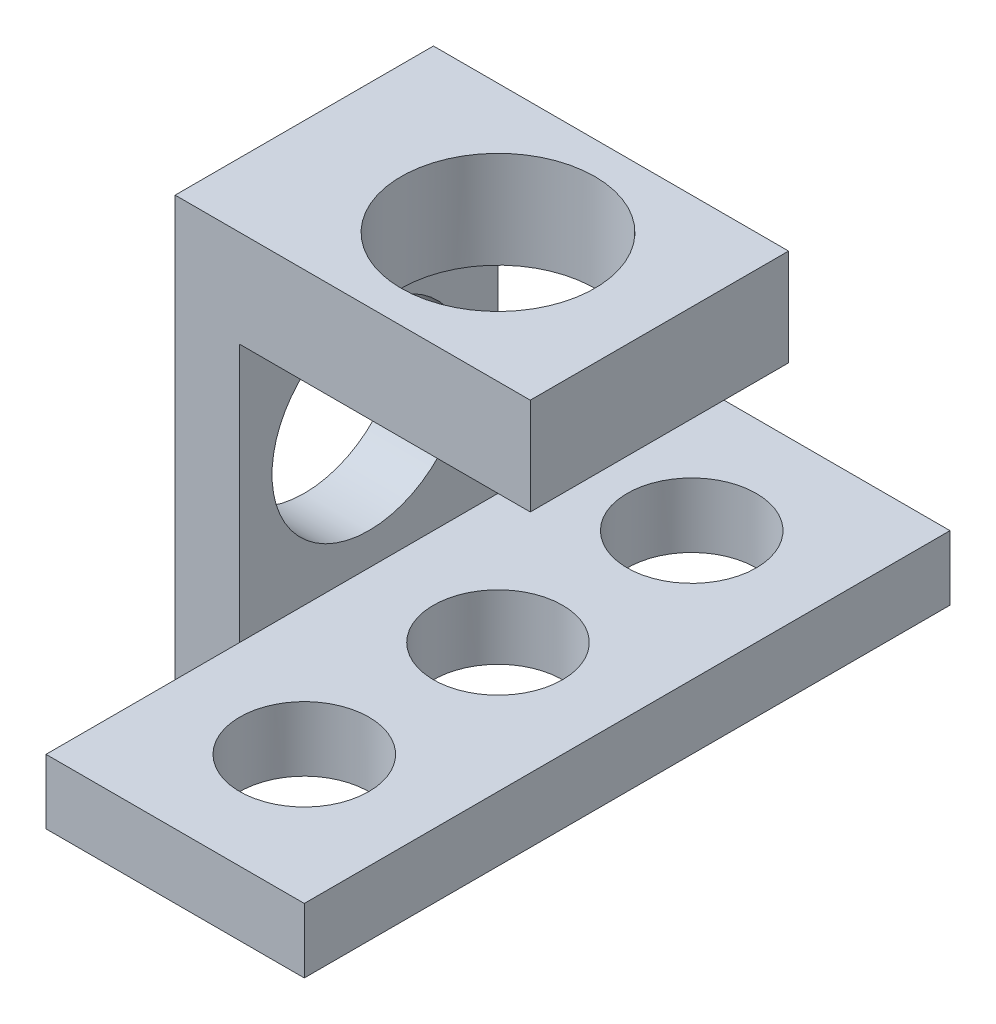
ISO-10303-21;
HEADER;
FILE_DESCRIPTION(('STEP AP214'),'2;1');
FILE_NAME('part.step','',(''),(''),'','','');
FILE_SCHEMA(('AUTOMOTIVE_DESIGN { 1 0 10303 214 1 1 1 1 }'));
ENDSEC;
DATA;
#1=APPLICATION_CONTEXT('core data for automotive mechanical design processes');
#2=APPLICATION_PROTOCOL_DEFINITION('international standard','automotive_design',2000,#1);
#3=PRODUCT_CONTEXT('',#1,'mechanical');
#4=PRODUCT('Part','Part','',(#3));
#5=PRODUCT_RELATED_PRODUCT_CATEGORY('part','',(#4));
#6=PRODUCT_DEFINITION_FORMATION('','',#4);
#7=PRODUCT_DEFINITION_CONTEXT('part definition',#1,'design');
#8=PRODUCT_DEFINITION('design','',#6,#7);
#9=PRODUCT_DEFINITION_SHAPE('','',#8);
#10=(LENGTH_UNIT() NAMED_UNIT(*) SI_UNIT(.MILLI.,.METRE.));
#11=(NAMED_UNIT(*) PLANE_ANGLE_UNIT() SI_UNIT($,.RADIAN.));
#12=(NAMED_UNIT(*) SI_UNIT($,.STERADIAN.) SOLID_ANGLE_UNIT());
#13=UNCERTAINTY_MEASURE_WITH_UNIT(LENGTH_MEASURE(1.E-05),#10,'distance_accuracy_value','');
#14=(GEOMETRIC_REPRESENTATION_CONTEXT(3) GLOBAL_UNCERTAINTY_ASSIGNED_CONTEXT((#13)) GLOBAL_UNIT_ASSIGNED_CONTEXT((#10,
#11,#12)) REPRESENTATION_CONTEXT('',''));
#15=CARTESIAN_POINT('',(0.,0.,0.));
#16=DIRECTION('',(0.,0.,1.));
#17=DIRECTION('',(1.,0.,0.));
#18=AXIS2_PLACEMENT_3D('',#15,#16,#17);
#19=CARTESIAN_POINT('',(-40.,0.,-20.));
#20=DIRECTION('',(-1.,0.,0.));
#21=DIRECTION('',(0.,0.,1.));
#22=AXIS2_PLACEMENT_3D('',#19,#20,#21);
#23=PLANE('',#22);
#24=CARTESIAN_POINT('',(-40.,30.,0.));
#25=DIRECTION('',(-1.,0.,0.));
#26=DIRECTION('',(0.,0.,1.));
#27=AXIS2_PLACEMENT_3D('',#24,#25,#26);
#28=CIRCLE('',#27,15.);
#29=CARTESIAN_POINT('',(-40.,15.,0.));
#30=VERTEX_POINT('',#29);
#31=EDGE_CURVE('E145',#30,#30,#28,.F.);
#32=ORIENTED_EDGE('',*,*,#31,.F.);
#33=EDGE_LOOP('',(#32));
#34=FACE_BOUND('',#33,.T.);
#35=DIRECTION('',(0.,0.,1.));
#36=VECTOR('',#35,1.);
#37=CARTESIAN_POINT('',(-40.,10.,-50.));
#38=LINE('',#37,#36);
#39=CARTESIAN_POINT('',(-40.,10.,-20.));
#40=VERTEX_POINT('',#39);
#41=CARTESIAN_POINT('',(-40.,10.,20.));
#42=VERTEX_POINT('',#41);
#43=EDGE_CURVE('E51',#40,#42,#38,.T.);
#44=ORIENTED_EDGE('',*,*,#43,.F.);
#45=DIRECTION('',(0.,-1.,0.));
#46=VECTOR('',#45,1.);
#47=CARTESIAN_POINT('',(-40.,0.,-20.));
#48=LINE('',#47,#46);
#49=CARTESIAN_POINT('',(-40.,50.,-20.));
#50=VERTEX_POINT('',#49);
#51=EDGE_CURVE('E189',#50,#40,#48,.T.);
#52=ORIENTED_EDGE('',*,*,#51,.F.);
#53=DIRECTION('',(0.,0.,1.));
#54=VECTOR('',#53,1.);
#55=CARTESIAN_POINT('',(-40.,50.,-20.));
#56=LINE('',#55,#54);
#57=CARTESIAN_POINT('',(-40.,50.,20.));
#58=VERTEX_POINT('',#57);
#59=EDGE_CURVE('E38',#50,#58,#56,.T.);
#60=ORIENTED_EDGE('',*,*,#59,.T.);
#61=DIRECTION('',(0.,-1.,0.));
#62=VECTOR('',#61,1.);
#63=CARTESIAN_POINT('',(-40.,0.,20.));
#64=LINE('',#63,#62);
#65=EDGE_CURVE('E172',#58,#42,#64,.T.);
#66=ORIENTED_EDGE('',*,*,#65,.T.);
#67=EDGE_LOOP('',(#44,#52,#60,#66));
#68=FACE_BOUND('',#67,.T.);
#69=ADVANCED_FACE('F35',(#34,#68),#23,.F.);
#70=CARTESIAN_POINT('',(0.,0.,-20.));
#71=DIRECTION('',(0.,1.,0.));
#72=DIRECTION('',(-1.,0.,0.));
#73=AXIS2_PLACEMENT_3D('',#70,#71,#72);
#74=PLANE('',#73);
#75=CARTESIAN_POINT('',(-20.,0.,30.));
#76=DIRECTION('',(0.,-1.,0.));
#77=DIRECTION('',(1.,0.,0.));
#78=AXIS2_PLACEMENT_3D('',#75,#76,#77);
#79=CIRCLE('',#78,10.);
#80=CARTESIAN_POINT('',(-10.,0.,30.));
#81=VERTEX_POINT('',#80);
#82=EDGE_CURVE('E417',#81,#81,#79,.T.);
#83=ORIENTED_EDGE('',*,*,#82,.F.);
#84=EDGE_LOOP('',(#83));
#85=FACE_BOUND('',#84,.T.);
#86=CARTESIAN_POINT('',(-20.,0.,0.));
#87=DIRECTION('',(0.,-1.,0.));
#88=DIRECTION('',(1.,0.,0.));
#89=AXIS2_PLACEMENT_3D('',#86,#87,#88);
#90=CIRCLE('',#89,10.);
#91=CARTESIAN_POINT('',(-10.,0.,0.));
#92=VERTEX_POINT('',#91);
#93=EDGE_CURVE('E424',#92,#92,#90,.T.);
#94=ORIENTED_EDGE('',*,*,#93,.F.);
#95=EDGE_LOOP('',(#94));
#96=FACE_BOUND('',#95,.T.);
#97=CARTESIAN_POINT('',(-20.,0.,-30.));
#98=DIRECTION('',(0.,-1.,0.));
#99=DIRECTION('',(1.,0.,0.));
#100=AXIS2_PLACEMENT_3D('',#97,#98,#99);
#101=CIRCLE('',#100,10.);
#102=CARTESIAN_POINT('',(-10.,0.,-30.));
#103=VERTEX_POINT('',#102);
#104=EDGE_CURVE('E430',#103,#103,#101,.T.);
#105=ORIENTED_EDGE('',*,*,#104,.F.);
#106=EDGE_LOOP('',(#105));
#107=FACE_BOUND('',#106,.T.);
#108=DIRECTION('',(-1.,0.,0.));
#109=VECTOR('',#108,1.);
#110=CARTESIAN_POINT('',(0.,0.,-20.));
#111=LINE('',#110,#109);
#112=CARTESIAN_POINT('',(-40.,0.,-20.));
#113=VERTEX_POINT('',#112);
#114=CARTESIAN_POINT('',(-50.,0.,-20.));
#115=VERTEX_POINT('',#114);
#116=EDGE_CURVE('E199',#113,#115,#111,.T.);
#117=ORIENTED_EDGE('',*,*,#116,.F.);
#118=DIRECTION('',(0.,0.,1.));
#119=VECTOR('',#118,1.);
#120=CARTESIAN_POINT('',(-40.,0.,-50.));
#121=LINE('',#120,#119);
#122=CARTESIAN_POINT('',(-40.,0.,-50.));
#123=VERTEX_POINT('',#122);
#124=EDGE_CURVE('E168',#123,#113,#121,.T.);
#125=ORIENTED_EDGE('',*,*,#124,.F.);
#126=DIRECTION('',(-1.,0.,0.));
#127=VECTOR('',#126,1.);
#128=CARTESIAN_POINT('',(0.,0.,-50.));
#129=LINE('',#128,#127);
#130=CARTESIAN_POINT('',(0.,0.,-50.));
#131=VERTEX_POINT('',#130);
#132=EDGE_CURVE('E160',#131,#123,#129,.T.);
#133=ORIENTED_EDGE('',*,*,#132,.F.);
#134=DIRECTION('',(0.,0.,1.));
#135=VECTOR('',#134,1.);
#136=CARTESIAN_POINT('',(0.,0.,-50.));
#137=LINE('',#136,#135);
#138=CARTESIAN_POINT('',(0.,0.,50.));
#139=VERTEX_POINT('',#138);
#140=EDGE_CURVE('E166',#131,#139,#137,.T.);
#141=ORIENTED_EDGE('',*,*,#140,.T.);
#142=DIRECTION('',(-1.,0.,0.));
#143=VECTOR('',#142,1.);
#144=CARTESIAN_POINT('',(0.,0.,50.));
#145=LINE('',#144,#143);
#146=CARTESIAN_POINT('',(-40.,0.,50.));
#147=VERTEX_POINT('',#146);
#148=EDGE_CURVE('E140',#139,#147,#145,.T.);
#149=ORIENTED_EDGE('',*,*,#148,.T.);
#150=CARTESIAN_POINT('',(-40.,0.,20.));
#151=VERTEX_POINT('',#150);
#152=EDGE_CURVE('E136',#151,#147,#121,.T.);
#153=ORIENTED_EDGE('',*,*,#152,.F.);
#154=DIRECTION('',(-1.,0.,0.));
#155=VECTOR('',#154,1.);
#156=CARTESIAN_POINT('',(0.,0.,20.));
#157=LINE('',#156,#155);
#158=CARTESIAN_POINT('',(-50.,0.,20.));
#159=VERTEX_POINT('',#158);
#160=EDGE_CURVE('E186',#151,#159,#157,.T.);
#161=ORIENTED_EDGE('',*,*,#160,.T.);
#162=DIRECTION('',(0.,0.,1.));
#163=VECTOR('',#162,1.);
#164=CARTESIAN_POINT('',(-50.,0.,-20.));
#165=LINE('',#164,#163);
#166=EDGE_CURVE('E11',#115,#159,#165,.T.);
#167=ORIENTED_EDGE('',*,*,#166,.F.);
#168=EDGE_LOOP('',(#117,#125,#133,#141,#149,#153,#161,#167));
#169=FACE_BOUND('',#168,.T.);
#170=ADVANCED_FACE('F227',(#85,#96,#107,#169),#74,.F.);
#171=CARTESIAN_POINT('',(-50.,0.,-20.));
#172=DIRECTION('',(1.,0.,0.));
#173=DIRECTION('',(0.,1.,0.));
#174=AXIS2_PLACEMENT_3D('',#171,#172,#173);
#175=PLANE('',#174);
#176=CARTESIAN_POINT('',(-50.,30.,0.));
#177=DIRECTION('',(-1.,0.,0.));
#178=DIRECTION('',(0.,-1.,0.));
#179=AXIS2_PLACEMENT_3D('',#176,#177,#178);
#180=CIRCLE('',#179,15.);
#181=CARTESIAN_POINT('',(-50.,15.,0.));
#182=VERTEX_POINT('',#181);
#183=EDGE_CURVE('E148',#182,#182,#180,.T.);
#184=ORIENTED_EDGE('',*,*,#183,.F.);
#185=EDGE_LOOP('',(#184));
#186=FACE_BOUND('',#185,.T.);
#187=ORIENTED_EDGE('',*,*,#166,.T.);
#188=DIRECTION('',(0.,1.,0.));
#189=VECTOR('',#188,1.);
#190=CARTESIAN_POINT('',(-50.,0.,20.));
#191=LINE('',#190,#189);
#192=CARTESIAN_POINT('',(-50.,65.,20.));
#193=VERTEX_POINT('',#192);
#194=EDGE_CURVE('E183',#159,#193,#191,.T.);
#195=ORIENTED_EDGE('',*,*,#194,.T.);
#196=DIRECTION('',(0.,0.,1.));
#197=VECTOR('',#196,1.);
#198=CARTESIAN_POINT('',(-50.,65.,-20.));
#199=LINE('',#198,#197);
#200=CARTESIAN_POINT('',(-50.,65.,-20.));
#201=VERTEX_POINT('',#200);
#202=EDGE_CURVE('E43',#201,#193,#199,.T.);
#203=ORIENTED_EDGE('',*,*,#202,.F.);
#204=DIRECTION('',(0.,1.,0.));
#205=VECTOR('',#204,1.);
#206=CARTESIAN_POINT('',(-50.,0.,-20.));
#207=LINE('',#206,#205);
#208=EDGE_CURVE('E197',#115,#201,#207,.T.);
#209=ORIENTED_EDGE('',*,*,#208,.F.);
#210=EDGE_LOOP('',(#187,#195,#203,#209));
#211=FACE_BOUND('',#210,.T.);
#212=ADVANCED_FACE('F232',(#186,#211),#175,.F.);
#213=CARTESIAN_POINT('',(0.,65.,-20.));
#214=DIRECTION('',(0.,-1.,0.));
#215=DIRECTION('',(0.,0.,-1.));
#216=AXIS2_PLACEMENT_3D('',#213,#214,#215);
#217=PLANE('',#216);
#218=CARTESIAN_POINT('',(-20.,65.,0.));
#219=DIRECTION('',(0.,1.,0.));
#220=DIRECTION('',(0.,0.,1.));
#221=AXIS2_PLACEMENT_3D('',#218,#219,#220);
#222=CIRCLE('',#221,15.);
#223=CARTESIAN_POINT('',(-20.,65.,15.));
#224=VERTEX_POINT('',#223);
#225=EDGE_CURVE('E279',#224,#224,#222,.T.);
#226=ORIENTED_EDGE('',*,*,#225,.F.);
#227=EDGE_LOOP('',(#226));
#228=FACE_BOUND('',#227,.T.);
#229=ORIENTED_EDGE('',*,*,#202,.T.);
#230=DIRECTION('',(1.,0.,0.));
#231=VECTOR('',#230,1.);
#232=CARTESIAN_POINT('',(0.,65.,20.));
#233=LINE('',#232,#231);
#234=CARTESIAN_POINT('',(5.,65.,20.));
#235=VERTEX_POINT('',#234);
#236=EDGE_CURVE('E180',#193,#235,#233,.T.);
#237=ORIENTED_EDGE('',*,*,#236,.T.);
#238=DIRECTION('',(0.,0.,1.));
#239=VECTOR('',#238,1.);
#240=CARTESIAN_POINT('',(5.,65.,-20.));
#241=LINE('',#240,#239);
#242=CARTESIAN_POINT('',(5.,65.,-20.));
#243=VERTEX_POINT('',#242);
#244=EDGE_CURVE('E202',#243,#235,#241,.T.);
#245=ORIENTED_EDGE('',*,*,#244,.F.);
#246=DIRECTION('',(1.,0.,0.));
#247=VECTOR('',#246,1.);
#248=CARTESIAN_POINT('',(0.,65.,-20.));
#249=LINE('',#248,#247);
#250=EDGE_CURVE('E195',#201,#243,#249,.T.);
#251=ORIENTED_EDGE('',*,*,#250,.F.);
#252=EDGE_LOOP('',(#229,#237,#245,#251));
#253=FACE_BOUND('',#252,.T.);
#254=ADVANCED_FACE('F222',(#228,#253),#217,.F.);
#255=CARTESIAN_POINT('',(5.00000000000001,0.,-20.));
#256=DIRECTION('',(-1.,0.,0.));
#257=DIRECTION('',(0.,-1.,0.));
#258=AXIS2_PLACEMENT_3D('',#255,#256,#257);
#259=PLANE('',#258);
#260=ORIENTED_EDGE('',*,*,#244,.T.);
#261=DIRECTION('',(0.,-1.,0.));
#262=VECTOR('',#261,1.);
#263=CARTESIAN_POINT('',(5.00000000000001,0.,20.));
#264=LINE('',#263,#262);
#265=CARTESIAN_POINT('',(5.,50.,20.));
#266=VERTEX_POINT('',#265);
#267=EDGE_CURVE('E177',#235,#266,#264,.T.);
#268=ORIENTED_EDGE('',*,*,#267,.T.);
#269=DIRECTION('',(0.,0.,1.));
#270=VECTOR('',#269,1.);
#271=CARTESIAN_POINT('',(5.,50.,-20.));
#272=LINE('',#271,#270);
#273=CARTESIAN_POINT('',(5.,50.,-20.));
#274=VERTEX_POINT('',#273);
#275=EDGE_CURVE('E203',#274,#266,#272,.T.);
#276=ORIENTED_EDGE('',*,*,#275,.F.);
#277=DIRECTION('',(0.,-1.,0.));
#278=VECTOR('',#277,1.);
#279=CARTESIAN_POINT('',(5.00000000000001,0.,-20.));
#280=LINE('',#279,#278);
#281=EDGE_CURVE('E193',#243,#274,#280,.T.);
#282=ORIENTED_EDGE('',*,*,#281,.F.);
#283=EDGE_LOOP('',(#260,#268,#276,#282));
#284=FACE_BOUND('',#283,.T.);
#285=ADVANCED_FACE('F214',(#284),#259,.F.);
#286=CARTESIAN_POINT('',(0.,50.,-20.));
#287=DIRECTION('',(0.,1.,0.));
#288=DIRECTION('',(-1.,0.,0.));
#289=AXIS2_PLACEMENT_3D('',#286,#287,#288);
#290=PLANE('',#289);
#291=CARTESIAN_POINT('',(-20.,50.,0.));
#292=DIRECTION('',(0.,1.,0.));
#293=DIRECTION('',(-1.,0.,0.));
#294=AXIS2_PLACEMENT_3D('',#291,#292,#293);
#295=CIRCLE('',#294,15.);
#296=CARTESIAN_POINT('',(-35.,50.,0.));
#297=VERTEX_POINT('',#296);
#298=EDGE_CURVE('E422',#297,#297,#295,.F.);
#299=ORIENTED_EDGE('',*,*,#298,.F.);
#300=EDGE_LOOP('',(#299));
#301=FACE_BOUND('',#300,.T.);
#302=ORIENTED_EDGE('',*,*,#275,.T.);
#303=DIRECTION('',(-1.,0.,0.));
#304=VECTOR('',#303,1.);
#305=CARTESIAN_POINT('',(0.,50.,20.));
#306=LINE('',#305,#304);
#307=EDGE_CURVE('E174',#266,#58,#306,.T.);
#308=ORIENTED_EDGE('',*,*,#307,.T.);
#309=ORIENTED_EDGE('',*,*,#59,.F.);
#310=DIRECTION('',(-1.,0.,0.));
#311=VECTOR('',#310,1.);
#312=CARTESIAN_POINT('',(0.,50.,-20.));
#313=LINE('',#312,#311);
#314=EDGE_CURVE('E191',#274,#50,#313,.T.);
#315=ORIENTED_EDGE('',*,*,#314,.F.);
#316=EDGE_LOOP('',(#302,#308,#309,#315));
#317=FACE_BOUND('',#316,.T.);
#318=ADVANCED_FACE('F211',(#301,#317),#290,.F.);
#319=CARTESIAN_POINT('',(0.,0.,-20.));
#320=DIRECTION('',(0.,0.,1.));
#321=DIRECTION('',(1.,0.,0.));
#322=AXIS2_PLACEMENT_3D('',#319,#320,#321);
#323=PLANE('',#322);
#324=ORIENTED_EDGE('',*,*,#51,.T.);
#325=DIRECTION('',(0.,-1.,0.));
#326=VECTOR('',#325,1.);
#327=CARTESIAN_POINT('',(-40.,0.,-20.));
#328=LINE('',#327,#326);
#329=EDGE_CURVE('E165',#40,#113,#328,.T.);
#330=ORIENTED_EDGE('',*,*,#329,.T.);
#331=ORIENTED_EDGE('',*,*,#116,.T.);
#332=ORIENTED_EDGE('',*,*,#208,.T.);
#333=ORIENTED_EDGE('',*,*,#250,.T.);
#334=ORIENTED_EDGE('',*,*,#281,.T.);
#335=ORIENTED_EDGE('',*,*,#314,.T.);
#336=EDGE_LOOP('',(#324,#330,#331,#332,#333,#334,#335));
#337=FACE_BOUND('',#336,.T.);
#338=ADVANCED_FACE('F213',(#337),#323,.F.);
#339=CARTESIAN_POINT('',(0.,0.,20.));
#340=DIRECTION('',(0.,0.,1.));
#341=DIRECTION('',(1.,0.,0.));
#342=AXIS2_PLACEMENT_3D('',#339,#340,#341);
#343=PLANE('',#342);
#344=ORIENTED_EDGE('',*,*,#65,.F.);
#345=ORIENTED_EDGE('',*,*,#307,.F.);
#346=ORIENTED_EDGE('',*,*,#267,.F.);
#347=ORIENTED_EDGE('',*,*,#236,.F.);
#348=ORIENTED_EDGE('',*,*,#194,.F.);
#349=ORIENTED_EDGE('',*,*,#160,.F.);
#350=EDGE_CURVE('E59',#42,#151,#64,.T.);
#351=ORIENTED_EDGE('',*,*,#350,.F.);
#352=EDGE_LOOP('',(#344,#345,#346,#347,#348,#349,#351));
#353=FACE_BOUND('',#352,.T.);
#354=ADVANCED_FACE('F209',(#353),#343,.T.);
#355=CARTESIAN_POINT('',(-40.,0.,-50.));
#356=DIRECTION('',(-1.,0.,0.));
#357=DIRECTION('',(0.,0.,1.));
#358=AXIS2_PLACEMENT_3D('',#355,#356,#357);
#359=PLANE('',#358);
#360=ORIENTED_EDGE('',*,*,#329,.F.);
#361=CARTESIAN_POINT('',(-40.,10.,-50.));
#362=VERTEX_POINT('',#361);
#363=EDGE_CURVE('E131',#362,#40,#38,.T.);
#364=ORIENTED_EDGE('',*,*,#363,.F.);
#365=DIRECTION('',(0.,-1.,0.));
#366=VECTOR('',#365,1.);
#367=CARTESIAN_POINT('',(-40.,0.,-50.));
#368=LINE('',#367,#366);
#369=EDGE_CURVE('E157',#362,#123,#368,.T.);
#370=ORIENTED_EDGE('',*,*,#369,.T.);
#371=ORIENTED_EDGE('',*,*,#124,.T.);
#372=EDGE_LOOP('',(#360,#364,#370,#371));
#373=FACE_BOUND('',#372,.T.);
#374=ADVANCED_FACE('F263',(#373),#359,.T.);
#375=CARTESIAN_POINT('',(0.,10.,-50.));
#376=DIRECTION('',(0.,-1.,0.));
#377=DIRECTION('',(0.,0.,-1.));
#378=AXIS2_PLACEMENT_3D('',#375,#376,#377);
#379=PLANE('',#378);
#380=CARTESIAN_POINT('',(-20.,10.,30.));
#381=DIRECTION('',(0.,-1.,0.));
#382=DIRECTION('',(0.,0.,-1.));
#383=AXIS2_PLACEMENT_3D('',#380,#381,#382);
#384=CIRCLE('',#383,10.);
#385=CARTESIAN_POINT('',(-20.,10.,20.));
#386=VERTEX_POINT('',#385);
#387=EDGE_CURVE('E420',#386,#386,#384,.F.);
#388=ORIENTED_EDGE('',*,*,#387,.F.);
#389=EDGE_LOOP('',(#388));
#390=FACE_BOUND('',#389,.T.);
#391=CARTESIAN_POINT('',(-20.,10.,0.));
#392=DIRECTION('',(0.,-1.,0.));
#393=DIRECTION('',(0.,0.,-1.));
#394=AXIS2_PLACEMENT_3D('',#391,#392,#393);
#395=CIRCLE('',#394,10.);
#396=CARTESIAN_POINT('',(-20.,10.,-10.));
#397=VERTEX_POINT('',#396);
#398=EDGE_CURVE('E427',#397,#397,#395,.F.);
#399=ORIENTED_EDGE('',*,*,#398,.F.);
#400=EDGE_LOOP('',(#399));
#401=FACE_BOUND('',#400,.T.);
#402=CARTESIAN_POINT('',(-20.,10.,-30.));
#403=DIRECTION('',(0.,-1.,0.));
#404=DIRECTION('',(0.,0.,-1.));
#405=AXIS2_PLACEMENT_3D('',#402,#403,#404);
#406=CIRCLE('',#405,10.);
#407=CARTESIAN_POINT('',(-20.,10.,-40.));
#408=VERTEX_POINT('',#407);
#409=EDGE_CURVE('E433',#408,#408,#406,.F.);
#410=ORIENTED_EDGE('',*,*,#409,.F.);
#411=EDGE_LOOP('',(#410));
#412=FACE_BOUND('',#411,.T.);
#413=ORIENTED_EDGE('',*,*,#363,.T.);
#414=ORIENTED_EDGE('',*,*,#43,.T.);
#415=CARTESIAN_POINT('',(-40.,10.,50.));
#416=VERTEX_POINT('',#415);
#417=EDGE_CURVE('E120',#42,#416,#38,.T.);
#418=ORIENTED_EDGE('',*,*,#417,.T.);
#419=DIRECTION('',(1.,0.,0.));
#420=VECTOR('',#419,1.);
#421=CARTESIAN_POINT('',(0.,10.,50.));
#422=LINE('',#421,#420);
#423=CARTESIAN_POINT('',(0.,10.,50.));
#424=VERTEX_POINT('',#423);
#425=EDGE_CURVE('E126',#416,#424,#422,.T.);
#426=ORIENTED_EDGE('',*,*,#425,.T.);
#427=DIRECTION('',(0.,0.,1.));
#428=VECTOR('',#427,1.);
#429=CARTESIAN_POINT('',(0.,10.,-50.));
#430=LINE('',#429,#428);
#431=CARTESIAN_POINT('',(0.,10.,-50.));
#432=VERTEX_POINT('',#431);
#433=EDGE_CURVE('E163',#432,#424,#430,.T.);
#434=ORIENTED_EDGE('',*,*,#433,.F.);
#435=DIRECTION('',(1.,0.,0.));
#436=VECTOR('',#435,1.);
#437=CARTESIAN_POINT('',(0.,10.,-50.));
#438=LINE('',#437,#436);
#439=EDGE_CURVE('E154',#362,#432,#438,.T.);
#440=ORIENTED_EDGE('',*,*,#439,.F.);
#441=EDGE_LOOP('',(#413,#414,#418,#426,#434,#440));
#442=FACE_BOUND('',#441,.T.);
#443=ADVANCED_FACE('F123',(#390,#401,#412,#442),#379,.F.);
#444=CARTESIAN_POINT('',(0.,0.,-50.));
#445=DIRECTION('',(-1.,0.,0.));
#446=DIRECTION('',(0.,-1.,0.));
#447=AXIS2_PLACEMENT_3D('',#444,#445,#446);
#448=PLANE('',#447);
#449=ORIENTED_EDGE('',*,*,#433,.T.);
#450=DIRECTION('',(0.,-1.,0.));
#451=VECTOR('',#450,1.);
#452=CARTESIAN_POINT('',(0.,0.,50.));
#453=LINE('',#452,#451);
#454=EDGE_CURVE('E144',#424,#139,#453,.T.);
#455=ORIENTED_EDGE('',*,*,#454,.T.);
#456=ORIENTED_EDGE('',*,*,#140,.F.);
#457=DIRECTION('',(0.,-1.,0.));
#458=VECTOR('',#457,1.);
#459=CARTESIAN_POINT('',(0.,0.,-50.));
#460=LINE('',#459,#458);
#461=EDGE_CURVE('E129',#432,#131,#460,.T.);
#462=ORIENTED_EDGE('',*,*,#461,.F.);
#463=EDGE_LOOP('',(#449,#455,#456,#462));
#464=FACE_BOUND('',#463,.T.);
#465=ADVANCED_FACE('F257',(#464),#448,.F.);
#466=ORIENTED_EDGE('',*,*,#417,.F.);
#467=ORIENTED_EDGE('',*,*,#350,.T.);
#468=ORIENTED_EDGE('',*,*,#152,.T.);
#469=DIRECTION('',(0.,-1.,0.));
#470=VECTOR('',#469,1.);
#471=CARTESIAN_POINT('',(-40.,0.,50.));
#472=LINE('',#471,#470);
#473=EDGE_CURVE('E133',#416,#147,#472,.T.);
#474=ORIENTED_EDGE('',*,*,#473,.F.);
#475=EDGE_LOOP('',(#466,#467,#468,#474));
#476=FACE_BOUND('',#475,.T.);
#477=ADVANCED_FACE('F134',(#476),#359,.T.);
#478=CARTESIAN_POINT('',(0.,0.,-50.));
#479=DIRECTION('',(0.,0.,1.));
#480=DIRECTION('',(1.,0.,0.));
#481=AXIS2_PLACEMENT_3D('',#478,#479,#480);
#482=PLANE('',#481);
#483=ORIENTED_EDGE('',*,*,#439,.T.);
#484=ORIENTED_EDGE('',*,*,#461,.T.);
#485=ORIENTED_EDGE('',*,*,#132,.T.);
#486=ORIENTED_EDGE('',*,*,#369,.F.);
#487=EDGE_LOOP('',(#483,#484,#485,#486));
#488=FACE_BOUND('',#487,.T.);
#489=ADVANCED_FACE('F249',(#488),#482,.F.);
#490=CARTESIAN_POINT('',(0.,0.,50.));
#491=DIRECTION('',(0.,0.,1.));
#492=DIRECTION('',(1.,0.,0.));
#493=AXIS2_PLACEMENT_3D('',#490,#491,#492);
#494=PLANE('',#493);
#495=ORIENTED_EDGE('',*,*,#425,.F.);
#496=ORIENTED_EDGE('',*,*,#473,.T.);
#497=ORIENTED_EDGE('',*,*,#148,.F.);
#498=ORIENTED_EDGE('',*,*,#454,.F.);
#499=EDGE_LOOP('',(#495,#496,#497,#498));
#500=FACE_BOUND('',#499,.T.);
#501=ADVANCED_FACE('F142',(#500),#494,.T.);
#502=CARTESIAN_POINT('',(5.00100000000001,30.,0.));
#503=DIRECTION('',(-1.,0.,0.));
#504=DIRECTION('',(0.,-1.,0.));
#505=AXIS2_PLACEMENT_3D('',#502,#503,#504);
#506=CYLINDRICAL_SURFACE('',#505,15.);
#507=CARTESIAN_POINT('',(-50.,15.,0.));
#508=CARTESIAN_POINT('',(-49.8958333333333,15.,0.));
#509=CARTESIAN_POINT('',(-49.7916666666667,15.,0.));
#510=CARTESIAN_POINT('',(-49.5833333333333,15.,0.));
#511=CARTESIAN_POINT('',(-49.4791666666667,15.,0.));
#512=CARTESIAN_POINT('',(-49.2708333333333,15.,0.));
#513=CARTESIAN_POINT('',(-49.1666666666667,15.,0.));
#514=CARTESIAN_POINT('',(-48.9583333333333,15.,0.));
#515=CARTESIAN_POINT('',(-48.8541666666667,15.,0.));
#516=CARTESIAN_POINT('',(-48.6458333333333,15.,0.));
#517=CARTESIAN_POINT('',(-48.5416666666667,15.,0.));
#518=CARTESIAN_POINT('',(-48.3333333333333,15.,0.));
#519=CARTESIAN_POINT('',(-48.2291666666667,15.,0.));
#520=CARTESIAN_POINT('',(-48.0208333333333,15.,0.));
#521=CARTESIAN_POINT('',(-47.9166666666667,15.,0.));
#522=CARTESIAN_POINT('',(-47.7083333333333,15.,0.));
#523=CARTESIAN_POINT('',(-47.6041666666667,15.,0.));
#524=CARTESIAN_POINT('',(-47.3958333333333,15.,0.));
#525=CARTESIAN_POINT('',(-47.2916666666667,15.,0.));
#526=CARTESIAN_POINT('',(-47.0833333333333,15.,0.));
#527=CARTESIAN_POINT('',(-46.9791666666667,15.,0.));
#528=CARTESIAN_POINT('',(-46.7708333333333,15.,0.));
#529=CARTESIAN_POINT('',(-46.6666666666667,15.,0.));
#530=CARTESIAN_POINT('',(-46.4583333333333,15.,0.));
#531=CARTESIAN_POINT('',(-46.3541666666667,15.,0.));
#532=CARTESIAN_POINT('',(-46.1458333333333,15.,0.));
#533=CARTESIAN_POINT('',(-46.0416666666667,15.,0.));
#534=CARTESIAN_POINT('',(-45.8333333333333,15.,0.));
#535=CARTESIAN_POINT('',(-45.7291666666667,15.,0.));
#536=CARTESIAN_POINT('',(-45.5208333333333,15.,0.));
#537=CARTESIAN_POINT('',(-45.4166666666667,15.,0.));
#538=CARTESIAN_POINT('',(-45.2083333333333,15.,0.));
#539=CARTESIAN_POINT('',(-45.1041666666667,15.,0.));
#540=CARTESIAN_POINT('',(-44.8958333333333,15.,0.));
#541=CARTESIAN_POINT('',(-44.7916666666667,15.,0.));
#542=CARTESIAN_POINT('',(-44.5833333333333,15.,0.));
#543=CARTESIAN_POINT('',(-44.4791666666667,15.,0.));
#544=CARTESIAN_POINT('',(-44.2708333333333,15.,0.));
#545=CARTESIAN_POINT('',(-44.1666666666667,15.,0.));
#546=CARTESIAN_POINT('',(-43.9583333333333,15.,0.));
#547=CARTESIAN_POINT('',(-43.8541666666667,15.,0.));
#548=CARTESIAN_POINT('',(-43.6458333333333,15.,0.));
#549=CARTESIAN_POINT('',(-43.5416666666667,15.,0.));
#550=CARTESIAN_POINT('',(-43.3333333333333,15.,0.));
#551=CARTESIAN_POINT('',(-43.2291666666667,15.,0.));
#552=CARTESIAN_POINT('',(-43.0208333333333,15.,0.));
#553=CARTESIAN_POINT('',(-42.9166666666667,15.,0.));
#554=CARTESIAN_POINT('',(-42.7083333333333,15.,0.));
#555=CARTESIAN_POINT('',(-42.6041666666667,15.,0.));
#556=CARTESIAN_POINT('',(-42.3958333333333,15.,0.));
#557=CARTESIAN_POINT('',(-42.2916666666667,15.,0.));
#558=CARTESIAN_POINT('',(-42.0833333333333,15.,0.));
#559=CARTESIAN_POINT('',(-41.9791666666667,15.,0.));
#560=CARTESIAN_POINT('',(-41.7708333333333,15.,0.));
#561=CARTESIAN_POINT('',(-41.6666666666667,15.,0.));
#562=CARTESIAN_POINT('',(-41.4583333333333,15.,0.));
#563=CARTESIAN_POINT('',(-41.3541666666667,15.,0.));
#564=CARTESIAN_POINT('',(-41.1458333333333,15.,0.));
#565=CARTESIAN_POINT('',(-41.0416666666667,15.,0.));
#566=CARTESIAN_POINT('',(-40.8333333333333,15.,0.));
#567=CARTESIAN_POINT('',(-40.7291666666667,15.,0.));
#568=CARTESIAN_POINT('',(-40.5208333333333,15.,0.));
#569=CARTESIAN_POINT('',(-40.4166666666667,15.,0.));
#570=CARTESIAN_POINT('',(-40.2083333333333,15.,0.));
#571=CARTESIAN_POINT('',(-40.1041666666667,15.,0.));
#572=CARTESIAN_POINT('',(-40.,15.,0.));
#573=B_SPLINE_CURVE_WITH_KNOTS('',3,(#507,#508,#509,#510,#511,#512,#513,#514,#515,#516,#517,
#518,#519,#520,#521,#522,#523,#524,#525,#526,#527,#528,#529,#530,#531,#532,#533,#534,#535,#536,
#537,#538,#539,#540,#541,#542,#543,#544,#545,#546,#547,#548,#549,#550,#551,#552,#553,#554,#555,
#556,#557,#558,#559,#560,#561,#562,#563,#564,#565,#566,#567,#568,#569,#570,#571,#572),
.UNSPECIFIED.,.F.,.F.,(4,2,2,2,2,2,2,2,2,2,2,2,2,2,2,2,2,2,2,2,2,2,2,2,2,2,2,2,2,2,2,2,4),(0.,
0.312500000000007,0.625000000000001,0.937500000000008,1.25,1.56250000000001,1.875,
2.18750000000001,2.5,2.81250000000001,3.125,3.43750000000001,3.75,4.06250000000001,4.375,
4.68750000000001,5.,5.31250000000001,5.62500000000001,5.93750000000001,6.25000000000001,
6.56250000000001,6.87500000000001,7.18750000000001,7.50000000000001,7.81250000000001,
8.12500000000001,8.43750000000001,8.75000000000001,9.06250000000001,9.37500000000001,
9.68750000000002,10.),.UNSPECIFIED.);
#574=EDGE_CURVE('BSEAM237',#182,#30,#573,.T.);
#575=ORIENTED_EDGE('',*,*,#183,.T.);
#576=ORIENTED_EDGE('',*,*,#31,.T.);
#577=ORIENTED_EDGE('',*,*,#574,.T.);
#578=ORIENTED_EDGE('',*,*,#574,.F.);
#579=EDGE_LOOP('',(#575,#577,#576,#578));
#580=FACE_BOUND('',#579,.T.);
#581=ADVANCED_FACE('F237',(#580),#506,.F.);
#582=CARTESIAN_POINT('',(-20.,-0.001000000000001,0.));
#583=DIRECTION('',(0.,1.,0.));
#584=DIRECTION('',(0.,0.,1.));
#585=AXIS2_PLACEMENT_3D('',#582,#583,#584);
#586=CYLINDRICAL_SURFACE('',#585,15.);
#587=ORIENTED_EDGE('',*,*,#225,.T.);
#588=EDGE_LOOP('',(#587));
#589=FACE_BOUND('',#588,.T.);
#590=ORIENTED_EDGE('',*,*,#298,.T.);
#591=EDGE_LOOP('',(#590));
#592=FACE_BOUND('',#591,.T.);
#593=ADVANCED_FACE('F239',(#589,#592),#586,.F.);
#594=CARTESIAN_POINT('',(-20.,65.001,-30.));
#595=DIRECTION('',(0.,-1.,0.));
#596=DIRECTION('',(1.,0.,0.));
#597=AXIS2_PLACEMENT_3D('',#594,#595,#596);
#598=CYLINDRICAL_SURFACE('',#597,10.);
#599=ORIENTED_EDGE('',*,*,#104,.T.);
#600=EDGE_LOOP('',(#599));
#601=FACE_BOUND('',#600,.T.);
#602=ORIENTED_EDGE('',*,*,#409,.T.);
#603=EDGE_LOOP('',(#602));
#604=FACE_BOUND('',#603,.T.);
#605=ADVANCED_FACE('F246',(#601,#604),#598,.F.);
#606=CARTESIAN_POINT('',(-20.,65.001,0.));
#607=DIRECTION('',(0.,-1.,0.));
#608=DIRECTION('',(1.,0.,0.));
#609=AXIS2_PLACEMENT_3D('',#606,#607,#608);
#610=CYLINDRICAL_SURFACE('',#609,10.);
#611=ORIENTED_EDGE('',*,*,#93,.T.);
#612=EDGE_LOOP('',(#611));
#613=FACE_BOUND('',#612,.T.);
#614=ORIENTED_EDGE('',*,*,#398,.T.);
#615=EDGE_LOOP('',(#614));
#616=FACE_BOUND('',#615,.T.);
#617=ADVANCED_FACE('F391',(#613,#616),#610,.F.);
#618=CARTESIAN_POINT('',(-20.,65.001,30.));
#619=DIRECTION('',(0.,-1.,0.));
#620=DIRECTION('',(1.,0.,0.));
#621=AXIS2_PLACEMENT_3D('',#618,#619,#620);
#622=CYLINDRICAL_SURFACE('',#621,10.);
#623=ORIENTED_EDGE('',*,*,#82,.T.);
#624=EDGE_LOOP('',(#623));
#625=FACE_BOUND('',#624,.T.);
#626=ORIENTED_EDGE('',*,*,#387,.T.);
#627=EDGE_LOOP('',(#626));
#628=FACE_BOUND('',#627,.T.);
#629=ADVANCED_FACE('F397',(#625,#628),#622,.F.);
#630=CLOSED_SHELL('',(#69,#170,#212,#254,#285,#318,#338,#354,#374,#443,#465,#477,#489,#501,#581,
#593,#605,#617,#629));
#631=MANIFOLD_SOLID_BREP('B2',#630);
#632=ADVANCED_BREP_SHAPE_REPRESENTATION('',(#18,#631),#14);
#633=SHAPE_DEFINITION_REPRESENTATION(#9,#632);
ENDSEC;
END-ISO-10303-21;
